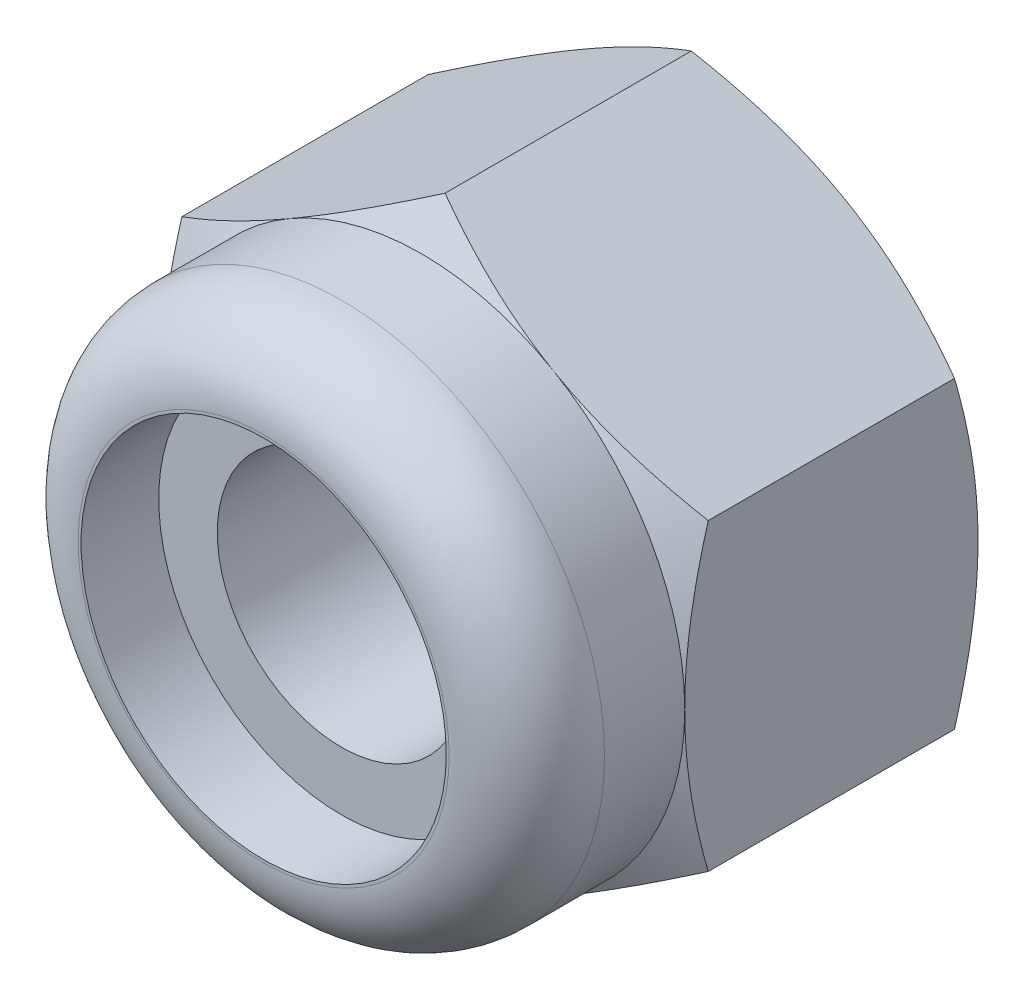
ISO-10303-21;
HEADER;
FILE_DESCRIPTION(('STEP AP214'),'2;1');
FILE_NAME('part.step','',(''),(''),'','','');
FILE_SCHEMA(('AUTOMOTIVE_DESIGN { 1 0 10303 214 1 1 1 1 }'));
ENDSEC;
DATA;
#1=APPLICATION_CONTEXT('core data for automotive mechanical design processes');
#2=APPLICATION_PROTOCOL_DEFINITION('international standard','automotive_design',2000,#1);
#3=PRODUCT_CONTEXT('',#1,'mechanical');
#4=PRODUCT('Part','Part','',(#3));
#5=PRODUCT_RELATED_PRODUCT_CATEGORY('part','',(#4));
#6=PRODUCT_DEFINITION_FORMATION('','',#4);
#7=PRODUCT_DEFINITION_CONTEXT('part definition',#1,'design');
#8=PRODUCT_DEFINITION('design','',#6,#7);
#9=PRODUCT_DEFINITION_SHAPE('','',#8);
#10=(LENGTH_UNIT() NAMED_UNIT(*) SI_UNIT(.MILLI.,.METRE.));
#11=(NAMED_UNIT(*) PLANE_ANGLE_UNIT() SI_UNIT($,.RADIAN.));
#12=(NAMED_UNIT(*) SI_UNIT($,.STERADIAN.) SOLID_ANGLE_UNIT());
#13=UNCERTAINTY_MEASURE_WITH_UNIT(LENGTH_MEASURE(1.E-05),#10,'distance_accuracy_value','');
#14=(GEOMETRIC_REPRESENTATION_CONTEXT(3) GLOBAL_UNCERTAINTY_ASSIGNED_CONTEXT((#13)) GLOBAL_UNIT_ASSIGNED_CONTEXT((#10,
#11,#12)) REPRESENTATION_CONTEXT('',''));
#15=CARTESIAN_POINT('',(0.,0.,0.));
#16=DIRECTION('',(0.,0.,1.));
#17=DIRECTION('',(1.,0.,0.));
#18=AXIS2_PLACEMENT_3D('',#15,#16,#17);
#19=CARTESIAN_POINT('',(0.,0.,-2.9));
#20=DIRECTION('',(0.,0.,1.));
#21=DIRECTION('',(1.,0.,0.));
#22=AXIS2_PLACEMENT_3D('',#19,#20,#21);
#23=CYLINDRICAL_SURFACE('',#22,1.65);
#24=CARTESIAN_POINT('',(0.,0.,2.06666666666667));
#25=DIRECTION('',(0.,0.,1.));
#26=DIRECTION('',(1.,0.,0.));
#27=AXIS2_PLACEMENT_3D('',#24,#25,#26);
#28=CIRCLE('',#27,1.65);
#29=CARTESIAN_POINT('',(1.65,0.,2.06666666666667));
#30=VERTEX_POINT('',#29);
#31=EDGE_CURVE('E443',#30,#30,#28,.T.);
#32=ORIENTED_EDGE('',*,*,#31,.T.);
#33=EDGE_LOOP('',(#32));
#34=FACE_BOUND('',#33,.T.);
#35=CARTESIAN_POINT('',(0.,0.,-2.6295273616266));
#36=DIRECTION('',(0.,0.,-1.));
#37=DIRECTION('',(-1.,0.,0.));
#38=AXIS2_PLACEMENT_3D('',#35,#36,#37);
#39=CIRCLE('',#38,1.65);
#40=CARTESIAN_POINT('',(-1.65,0.,-2.6295273616266));
#41=VERTEX_POINT('',#40);
#42=EDGE_CURVE('E166',#41,#41,#39,.F.);
#43=ORIENTED_EDGE('',*,*,#42,.F.);
#44=EDGE_LOOP('',(#43));
#45=FACE_BOUND('',#44,.T.);
#46=ADVANCED_FACE('F45',(#34,#45),#23,.F.);
#47=CARTESIAN_POINT('',(0.,4.04145188432738,-2.9));
#48=DIRECTION('',(-0.5,0.866025403784438,0.));
#49=DIRECTION('',(-0.866025403784438,-0.5,0.));
#50=AXIS2_PLACEMENT_3D('',#47,#48,#49);
#51=PLANE('',#50);
#52=DIRECTION('',(0.,0.,1.));
#53=VECTOR('',#52,1.);
#54=CARTESIAN_POINT('',(-3.5,2.02072594216369,-2.9));
#55=LINE('',#54,#53);
#56=CARTESIAN_POINT('',(-3.5,2.02072594216369,-2.58739260883035));
#57=VERTEX_POINT('',#56);
#58=CARTESIAN_POINT('',(-3.5,2.02072594216369,0.687392608830357));
#59=VERTEX_POINT('',#58);
#60=EDGE_CURVE('E151',#57,#59,#55,.T.);
#61=ORIENTED_EDGE('',*,*,#60,.T.);
#62=CARTESIAN_POINT('',(-3.5,2.02072594216369,0.687392608830358));
#63=CARTESIAN_POINT('',(-3.34753571198862,2.10875123988887,0.738237847268872));
#64=CARTESIAN_POINT('',(-3.19373835061782,2.19754618787695,0.784514344452547));
#65=CARTESIAN_POINT('',(-2.88479784793483,2.37591307026456,0.865084124311509));
#66=CARTESIAN_POINT('',(-2.72966825446088,2.46547718281602,0.899447412529487));
#67=CARTESIAN_POINT('',(-2.4954591528071,2.60069787070249,0.940394059302186));
#68=CARTESIAN_POINT('',(-2.41707581170764,2.64595251378624,0.952281641699641));
#69=CARTESIAN_POINT('',(-2.25994429612165,2.73667243660799,0.972247101680118));
#70=CARTESIAN_POINT('',(-2.18119612890669,2.78213771214774,0.980325054868103));
#71=CARTESIAN_POINT('',(-2.02299709460797,2.87347396718564,0.992499540829782));
#72=CARTESIAN_POINT('',(-1.94354483321946,2.91934575168602,0.996572117730429));
#73=CARTESIAN_POINT('',(-1.78454594405513,3.0111438031459,1.00056823982665));
#74=CARTESIAN_POINT('',(-1.70499929998391,3.05707007951355,1.00049091474959));
#75=CARTESIAN_POINT('',(-1.62549330307455,3.10297288823136,0.998295949684423));
#76=B_SPLINE_CURVE_WITH_KNOTS('',3,(#62,#63,#64,#65,#66,#67,#68,#69,#70,#71,#72,#73,#74,#75),
.UNSPECIFIED.,.F.,.F.,(4,2,2,2,2,2,4),(0.,0.550013721798602,1.09673832371843,1.37052430293701,
1.64430484843786,1.91971307497045,2.19517905736821),.UNSPECIFIED.);
#77=CARTESIAN_POINT('',(-1.75000000000827,3.03108891324076,0.999999999999999));
#78=VERTEX_POINT('',#77);
#79=EDGE_CURVE('E117',#59,#78,#76,.T.);
#80=ORIENTED_EDGE('',*,*,#79,.T.);
#81=CARTESIAN_POINT('',(0.,4.04145188432738,0.687392608830358));
#82=CARTESIAN_POINT('',(-0.15246428801139,3.9534265866022,0.738237847268873));
#83=CARTESIAN_POINT('',(-0.306261649382186,3.86463163861412,0.784514344452547));
#84=CARTESIAN_POINT('',(-0.615202152065175,3.68626475622652,0.865084124311508));
#85=CARTESIAN_POINT('',(-0.770331745539122,3.59670064367506,0.899447412529487));
#86=CARTESIAN_POINT('',(-1.0045408471929,3.46147995578859,0.940394059302185));
#87=CARTESIAN_POINT('',(-1.08292418829236,3.41622531270483,0.95228164169964));
#88=CARTESIAN_POINT('',(-1.24005570387836,3.32550538988308,0.972247101680118));
#89=CARTESIAN_POINT('',(-1.31880387109331,3.28004011434334,0.980325054868103));
#90=CARTESIAN_POINT('',(-1.47700290539203,3.18870385930544,0.992499540829782));
#91=CARTESIAN_POINT('',(-1.55645516678054,3.14283207480505,0.996572117730429));
#92=CARTESIAN_POINT('',(-1.71545405594487,3.05103402334518,1.00056823982665));
#93=CARTESIAN_POINT('',(-1.79500070001609,3.00510774697753,1.00049091474959));
#94=CARTESIAN_POINT('',(-1.87450669692545,2.95920493825972,0.998295949684423));
#95=B_SPLINE_CURVE_WITH_KNOTS('',3,(#81,#82,#83,#84,#85,#86,#87,#88,#89,#90,#91,#92,#93,#94),
.UNSPECIFIED.,.F.,.F.,(4,2,2,2,2,2,4),(0.,0.550013721798602,1.09673832371842,1.37052430293701,
1.64430484843786,1.91971307497045,2.1951790573682),.UNSPECIFIED.);
#96=CARTESIAN_POINT('',(0.,4.04145188432738,0.687392608830354));
#97=VERTEX_POINT('',#96);
#98=EDGE_CURVE('E315',#78,#97,#95,.F.);
#99=ORIENTED_EDGE('',*,*,#98,.T.);
#100=DIRECTION('',(0.,0.,1.));
#101=VECTOR('',#100,1.);
#102=CARTESIAN_POINT('',(0.,4.04145188432738,-2.9));
#103=LINE('',#102,#101);
#104=CARTESIAN_POINT('',(0.,4.04145188432738,-2.58739260883035));
#105=VERTEX_POINT('',#104);
#106=EDGE_CURVE('E130',#105,#97,#103,.T.);
#107=ORIENTED_EDGE('',*,*,#106,.F.);
#108=CARTESIAN_POINT('',(-3.5002,2.02061047210985,-2.58732593930663));
#109=CARTESIAN_POINT('',(-3.34639282154755,2.10941108799267,-2.63861421101002));
#110=CARTESIAN_POINT('',(-3.19125798916558,2.19897822522909,-2.6852590461838));
#111=CARTESIAN_POINT('',(-2.87830199342322,2.37966345361545,-2.76667812446665));
#112=CARTESIAN_POINT('',(-2.72047526921251,2.47078475532382,-2.80142356441544));
#113=CARTESIAN_POINT('',(-2.40677778961988,2.65189807961074,-2.85550997281716));
#114=CARTESIAN_POINT('',(-2.25095530083931,2.74186223545399,-2.87521091373962));
#115=CARTESIAN_POINT('',(-1.93857711279463,2.92221386641056,-2.89872986726274));
#116=CARTESIAN_POINT('',(-1.78202254896577,3.01260068598001,-2.90256735545443));
#117=CARTESIAN_POINT('',(-1.48949078007901,3.1814939814933,-2.89458469812302));
#118=CARTESIAN_POINT('',(-1.3534697875421,3.26002573814993,-2.88472456593039));
#119=CARTESIAN_POINT('',(-1.08231397971101,3.41657761679354,-2.85347353310059));
#120=CARTESIAN_POINT('',(-0.94718010231532,3.49459719728458,-2.8320719567142));
#121=CARTESIAN_POINT('',(-0.675465207594818,3.65147186489429,-2.77856959211942));
#122=CARTESIAN_POINT('',(-0.538918580721666,3.73030709667644,-2.74624200555491));
#123=CARTESIAN_POINT('',(-0.2678619070555,3.88680174018324,-2.672871066192));
#124=CARTESIAN_POINT('',(-0.133348387531464,3.96446315689009,-2.63184495343013));
#125=CARTESIAN_POINT('',(0.000199999999999747,4.04156735438122,-2.58732593930662));
#126=B_SPLINE_CURVE_WITH_KNOTS('',3,(#108,#109,#110,#111,#112,#113,#114,#115,#116,#117,#118,
#119,#120,#121,#122,#123,#124,#125),.UNSPECIFIED.,.F.,.F.,(4,2,2,2,2,2,2,2,4),(0.,
0.554793832886253,1.11092123814984,1.65328467083219,2.19498204478403,2.6666513085086,
3.13875761298267,3.6213361260051,4.10296698719187),.UNSPECIFIED.);
#127=CARTESIAN_POINT('',(-1.75,3.03108891324554,-2.9));
#128=VERTEX_POINT('',#127);
#129=EDGE_CURVE('E155',#128,#105,#126,.T.);
#130=ORIENTED_EDGE('',*,*,#129,.F.);
#131=EDGE_CURVE('E217',#57,#128,#126,.T.);
#132=ORIENTED_EDGE('',*,*,#131,.F.);
#133=EDGE_LOOP('',(#61,#80,#99,#107,#130,#132));
#134=FACE_BOUND('',#133,.T.);
#135=ADVANCED_FACE('F320',(#134),#51,.T.);
#136=CARTESIAN_POINT('',(3.5,2.02072594216368,-2.9));
#137=DIRECTION('',(0.5,0.866025403784438,0.));
#138=DIRECTION('',(-0.866025403784438,0.5,0.));
#139=AXIS2_PLACEMENT_3D('',#136,#137,#138);
#140=PLANE('',#139);
#141=ORIENTED_EDGE('',*,*,#106,.T.);
#142=CARTESIAN_POINT('',(0.,4.04145188432738,0.687392608830362));
#143=CARTESIAN_POINT('',(0.152464288011386,3.9534265866022,0.738237847268876));
#144=CARTESIAN_POINT('',(0.306261649382182,3.86463163861412,0.78451434445255));
#145=CARTESIAN_POINT('',(0.61520215206517,3.68626475622651,0.865084124311512));
#146=CARTESIAN_POINT('',(0.770331745539117,3.59670064367505,0.899447412529491));
#147=CARTESIAN_POINT('',(1.0045408471929,3.46147995578858,0.940394059302189));
#148=CARTESIAN_POINT('',(1.08292418829236,3.41622531270483,0.952281641699644));
#149=CARTESIAN_POINT('',(1.24005570387835,3.32550538988308,0.972247101680121));
#150=CARTESIAN_POINT('',(1.31880387109331,3.28004011434333,0.980325054868106));
#151=CARTESIAN_POINT('',(1.47700290539202,3.18870385930543,0.992499540829786));
#152=CARTESIAN_POINT('',(1.55645516678054,3.14283207480505,0.996572117730432));
#153=CARTESIAN_POINT('',(1.71545405594486,3.05103402334517,1.00056823982665));
#154=CARTESIAN_POINT('',(1.79500070001608,3.00510774697753,1.00049091474959));
#155=CARTESIAN_POINT('',(1.87450669692545,2.95920493825971,0.998295949684427));
#156=B_SPLINE_CURVE_WITH_KNOTS('',3,(#142,#143,#144,#145,#146,#147,#148,#149,#150,#151,#152,
#153,#154,#155),.UNSPECIFIED.,.F.,.F.,(4,2,2,2,2,2,4),(0.,0.550013721798601,1.09673832371842,
1.37052430293701,1.64430484843785,1.91971307497045,2.1951790573682),.UNSPECIFIED.);
#157=CARTESIAN_POINT('',(1.75,3.03108891324553,1.));
#158=VERTEX_POINT('',#157);
#159=EDGE_CURVE('E108',#97,#158,#156,.T.);
#160=ORIENTED_EDGE('',*,*,#159,.T.);
#161=CARTESIAN_POINT('',(3.5,2.02072594216368,0.687392608830362));
#162=CARTESIAN_POINT('',(3.34753571198861,2.10875123988886,0.738237847268876));
#163=CARTESIAN_POINT('',(3.19373835061782,2.19754618787695,0.784514344452551));
#164=CARTESIAN_POINT('',(2.88479784793483,2.37591307026455,0.865084124311512));
#165=CARTESIAN_POINT('',(2.72966825446088,2.46547718281601,0.899447412529491));
#166=CARTESIAN_POINT('',(2.4954591528071,2.60069787070248,0.940394059302189));
#167=CARTESIAN_POINT('',(2.41707581170764,2.64595251378624,0.952281641699644));
#168=CARTESIAN_POINT('',(2.25994429612165,2.73667243660798,0.972247101680121));
#169=CARTESIAN_POINT('',(2.18119612890669,2.78213771214773,0.980325054868106));
#170=CARTESIAN_POINT('',(2.02299709460797,2.87347396718563,0.992499540829786));
#171=CARTESIAN_POINT('',(1.94354483321946,2.91934575168601,0.996572117730432));
#172=CARTESIAN_POINT('',(1.78454594405513,3.01114380314589,1.00056823982665));
#173=CARTESIAN_POINT('',(1.70499929998392,3.05707007951354,1.00049091474959));
#174=CARTESIAN_POINT('',(1.62549330307455,3.10297288823135,0.998295949684427));
#175=B_SPLINE_CURVE_WITH_KNOTS('',3,(#161,#162,#163,#164,#165,#166,#167,#168,#169,#170,#171,
#172,#173,#174),.UNSPECIFIED.,.F.,.F.,(4,2,2,2,2,2,4),(0.,0.550013721798602,1.09673832371842,
1.37052430293701,1.64430484843786,1.91971307497045,2.1951790573682),.UNSPECIFIED.);
#176=CARTESIAN_POINT('',(3.5,2.02072594216368,0.687392608830358));
#177=VERTEX_POINT('',#176);
#178=EDGE_CURVE('E50',#158,#177,#175,.F.);
#179=ORIENTED_EDGE('',*,*,#178,.T.);
#180=DIRECTION('',(0.,0.,1.));
#181=VECTOR('',#180,1.);
#182=CARTESIAN_POINT('',(3.5,2.02072594216368,-2.9));
#183=LINE('',#182,#181);
#184=CARTESIAN_POINT('',(3.5,2.02072594216369,-2.58739260883035));
#185=VERTEX_POINT('',#184);
#186=EDGE_CURVE('E122',#185,#177,#183,.T.);
#187=ORIENTED_EDGE('',*,*,#186,.F.);
#188=CARTESIAN_POINT('',(-0.000200000000000202,4.04156735438122,-2.58732593930662));
#189=CARTESIAN_POINT('',(0.153607178452447,3.9527667384984,-2.63861421101002));
#190=CARTESIAN_POINT('',(0.308742010834422,3.86319960126198,-2.6852590461838));
#191=CARTESIAN_POINT('',(0.621698006576779,3.68251437287562,-2.76667812446665));
#192=CARTESIAN_POINT('',(0.779524730787494,3.59139307116725,-2.80142356441544));
#193=CARTESIAN_POINT('',(1.09322221038013,3.41027974688033,-2.85550997281717));
#194=CARTESIAN_POINT('',(1.24904469916069,3.32031559103708,-2.87521091373962));
#195=CARTESIAN_POINT('',(1.56142288720537,3.13996396008051,-2.89872986726275));
#196=CARTESIAN_POINT('',(1.71797745103423,3.04957714051106,-2.90256735545444));
#197=CARTESIAN_POINT('',(2.01050921992099,2.88068384499777,-2.89458469812303));
#198=CARTESIAN_POINT('',(2.14653021245791,2.80215208834114,-2.88472456593039));
#199=CARTESIAN_POINT('',(2.41768602028899,2.64560020969753,-2.8534735331006));
#200=CARTESIAN_POINT('',(2.55281989768468,2.56758062920649,-2.8320719567142));
#201=CARTESIAN_POINT('',(2.82453479240518,2.41070596159678,-2.77856959211943));
#202=CARTESIAN_POINT('',(2.96108141927833,2.33187072981463,-2.74624200555492));
#203=CARTESIAN_POINT('',(3.2321380929445,2.17537608630782,-2.67287106619201));
#204=CARTESIAN_POINT('',(3.36665161246854,2.09771466960098,-2.63184495343013));
#205=CARTESIAN_POINT('',(3.5002,2.02061047210985,-2.58732593930663));
#206=B_SPLINE_CURVE_WITH_KNOTS('',3,(#188,#189,#190,#191,#192,#193,#194,#195,#196,#197,#198,
#199,#200,#201,#202,#203,#204,#205),.UNSPECIFIED.,.F.,.F.,(4,2,2,2,2,2,2,2,4),(0.,
0.554793832886255,1.11092123814984,1.65328467083219,2.19498204478404,2.6666513085086,
3.13875761298268,3.6213361260051,4.10296698719188),.UNSPECIFIED.);
#207=CARTESIAN_POINT('',(1.75,3.03108891324554,-2.9));
#208=VERTEX_POINT('',#207);
#209=EDGE_CURVE('E387',#208,#185,#206,.T.);
#210=ORIENTED_EDGE('',*,*,#209,.F.);
#211=EDGE_CURVE('E417',#105,#208,#206,.T.);
#212=ORIENTED_EDGE('',*,*,#211,.F.);
#213=EDGE_LOOP('',(#141,#160,#179,#187,#210,#212));
#214=FACE_BOUND('',#213,.T.);
#215=ADVANCED_FACE('F120',(#214),#140,.T.);
#216=CARTESIAN_POINT('',(3.5,2.02072594216368,-2.9));
#217=DIRECTION('',(-1.,0.,0.));
#218=DIRECTION('',(0.,0.,1.));
#219=AXIS2_PLACEMENT_3D('',#216,#217,#218);
#220=PLANE('',#219);
#221=CARTESIAN_POINT('',(3.5,-2.0207259421637,0.687392608830358));
#222=CARTESIAN_POINT('',(3.5,-1.84467534671334,0.738237847268873));
#223=CARTESIAN_POINT('',(3.5,-1.66708545073717,0.784514344452548));
#224=CARTESIAN_POINT('',(3.5,-1.31035168596197,0.865084124311509));
#225=CARTESIAN_POINT('',(3.5,-1.13122346085904,0.899447412529488));
#226=CARTESIAN_POINT('',(3.5,-0.860782085086102,0.940394059302187));
#227=CARTESIAN_POINT('',(3.5,-0.77027279891859,0.952281641699641));
#228=CARTESIAN_POINT('',(3.5,-0.588832953275097,0.972247101680119));
#229=CARTESIAN_POINT('',(3.5,-0.497902402195605,0.980325054868104));
#230=CARTESIAN_POINT('',(3.5,-0.3152298921198,0.992499540829784));
#231=CARTESIAN_POINT('',(3.5,-0.223486323119036,0.99657211773043));
#232=CARTESIAN_POINT('',(3.5,-0.039890220199284,1.00056823982665));
#233=CARTESIAN_POINT('',(3.5,0.0519623325360135,1.00049091474959));
#234=CARTESIAN_POINT('',(3.5,0.143767949971636,0.998295949684424));
#235=B_SPLINE_CURVE_WITH_KNOTS('',3,(#221,#222,#223,#224,#225,#226,#227,#228,#229,#230,#231,
#232,#233,#234),.UNSPECIFIED.,.F.,.F.,(4,2,2,2,2,2,4),(0.,0.550013721798603,1.09673832371842,
1.37052430293701,1.64430484843786,1.91971307497045,2.1951790573682),.UNSPECIFIED.);
#236=CARTESIAN_POINT('',(3.5,-2.02072594216369,0.687392608830355));
#237=VERTEX_POINT('',#236);
#238=CARTESIAN_POINT('',(3.5,0.,1.));
#239=VERTEX_POINT('',#238);
#240=EDGE_CURVE('E191',#237,#239,#235,.T.);
#241=ORIENTED_EDGE('',*,*,#240,.F.);
#242=DIRECTION('',(0.,0.,1.));
#243=VECTOR('',#242,1.);
#244=CARTESIAN_POINT('',(3.5,-2.02072594216369,-2.9));
#245=LINE('',#244,#243);
#246=CARTESIAN_POINT('',(3.5,-2.02072594216369,-2.58739260883035));
#247=VERTEX_POINT('',#246);
#248=EDGE_CURVE('E131',#247,#237,#245,.T.);
#249=ORIENTED_EDGE('',*,*,#248,.F.);
#250=CARTESIAN_POINT('',(3.5,-5.35926299121406,-1.22515653141444));
#251=CARTESIAN_POINT('',(3.5,-5.20559319908842,-1.29941826307896));
#252=CARTESIAN_POINT('',(3.5,-5.05156008083376,-1.37294177166853));
#253=CARTESIAN_POINT('',(3.5,-4.74257074180711,-1.51809049655248));
#254=CARTESIAN_POINT('',(3.5,-4.58761436682437,-1.58971538417867));
#255=CARTESIAN_POINT('',(3.5,-4.27574500225543,-1.73102234482376));
#256=CARTESIAN_POINT('',(3.5,-4.11882589028192,-1.80069095431984));
#257=CARTESIAN_POINT('',(3.5,-3.80369792903856,-1.93703573775724));
#258=CARTESIAN_POINT('',(3.5,-3.64548914750596,-2.00371206768048));
#259=CARTESIAN_POINT('',(3.5,-3.32556618401856,-2.13406818090493));
#260=CARTESIAN_POINT('',(3.5,-3.16383281219924,-2.19770112631113));
#261=CARTESIAN_POINT('',(3.5,-2.83845840945598,-2.31998329791051));
#262=CARTESIAN_POINT('',(3.5,-2.67481716858826,-2.37863196962931));
#263=CARTESIAN_POINT('',(3.5,-2.34570278472049,-2.48936972012298));
#264=CARTESIAN_POINT('',(3.5,-2.18023438248743,-2.54147274456414));
#265=CARTESIAN_POINT('',(3.5,-1.8469452280637,-2.63742706302356));
#266=CARTESIAN_POINT('',(3.5,-1.6791252378753,-2.68128096653284));
#267=CARTESIAN_POINT('',(3.5,-1.34101828610925,-2.75860805441521));
#268=CARTESIAN_POINT('',(3.5,-1.17073068027694,-2.79207847478803));
#269=CARTESIAN_POINT('',(3.5,-0.828102385138487,-2.84638504356795));
#270=CARTESIAN_POINT('',(3.5,-0.655761694017305,-2.86722118080476));
#271=CARTESIAN_POINT('',(3.5,-0.311020490924452,-2.89441591349424));
#272=CARTESIAN_POINT('',(3.5,-0.138627397207262,-2.90086616316591));
#273=CARTESIAN_POINT('',(3.5,0.206038074906533,-2.89894644192205));
#274=CARTESIAN_POINT('',(3.5,0.378310473023177,-2.89058031803657));
#275=CARTESIAN_POINT('',(3.5,0.672490555822325,-2.86423110721311));
#276=CARTESIAN_POINT('',(3.5,0.79472279108409,-2.84967936596158));
#277=CARTESIAN_POINT('',(3.5,1.0382430543056,-2.81406326594664));
#278=CARTESIAN_POINT('',(3.5,1.15953093025886,-2.79299788007386));
#279=CARTESIAN_POINT('',(3.5,1.52187914771348,-2.72113681291855));
#280=CARTESIAN_POINT('',(3.5,1.76124104212632,-2.66169472437799));
#281=CARTESIAN_POINT('',(3.5,2.11940971387708,-2.55917318559745));
#282=CARTESIAN_POINT('',(3.5,2.24008344316346,-2.52225030091482));
#283=CARTESIAN_POINT('',(3.5,2.48017139213728,-2.44475099230071));
#284=CARTESIAN_POINT('',(3.5,2.59958641795613,-2.40417708833645));
#285=CARTESIAN_POINT('',(3.5,2.83665760451798,-2.32022001321725));
#286=CARTESIAN_POINT('',(3.5,2.95431988203483,-2.27685393996569));
#287=CARTESIAN_POINT('',(3.5,3.188731535088,-2.18757644043314));
#288=CARTESIAN_POINT('',(3.5,3.30548051959464,-2.14166398540705));
#289=CARTESIAN_POINT('',(3.5,3.42180736613349,-2.09472961927593));
#290=B_SPLINE_CURVE_WITH_KNOTS('',3,(#250,#251,#252,#253,#254,#255,#256,#257,#258,#259,#260,
#261,#262,#263,#264,#265,#266,#267,#268,#269,#270,#271,#272,#273,#274,#275,#276,#277,#278,#279,
#280,#281,#282,#283,#284,#285,#286,#287,#288,#289),.UNSPECIFIED.,.F.,.F.,(4,2,2,2,2,2,2,2,2,2,2,
2,2,2,2,2,2,2,2,4),(0.,0.512025318465737,1.02413870177436,1.53918270315241,2.05419982499224,
2.57553975872798,3.09693761309353,3.61720506610401,4.13730766217537,4.65754858684365,
5.17778997146961,5.69470725122282,6.21149033452401,6.58059623222331,6.94976036239485,
7.68863804939851,8.06719621660478,8.44549507476761,8.82166461280099,9.19798724733411),.UNSPECIFIED.);
#291=CARTESIAN_POINT('',(3.5,0.,-2.9));
#292=VERTEX_POINT('',#291);
#293=EDGE_CURVE('E208',#247,#292,#290,.T.);
#294=ORIENTED_EDGE('',*,*,#293,.T.);
#295=EDGE_CURVE('E128',#292,#185,#290,.T.);
#296=ORIENTED_EDGE('',*,*,#295,.T.);
#297=ORIENTED_EDGE('',*,*,#186,.T.);
#298=CARTESIAN_POINT('',(3.5,2.02072594216369,0.687392608830361));
#299=CARTESIAN_POINT('',(3.5,1.84467534671333,0.738237847268875));
#300=CARTESIAN_POINT('',(3.5,1.66708545073716,0.784514344452549));
#301=CARTESIAN_POINT('',(3.5,1.31035168596196,0.865084124311511));
#302=CARTESIAN_POINT('',(3.5,1.13122346085904,0.89944741252949));
#303=CARTESIAN_POINT('',(3.5,0.860782085086093,0.940394059302188));
#304=CARTESIAN_POINT('',(3.5,0.770272798918581,0.952281641699643));
#305=CARTESIAN_POINT('',(3.5,0.588832953275089,0.97224710168012));
#306=CARTESIAN_POINT('',(3.5,0.497902402195597,0.980325054868105));
#307=CARTESIAN_POINT('',(3.5,0.315229892119792,0.992499540829784));
#308=CARTESIAN_POINT('',(3.5,0.223486323119028,0.99657211773043));
#309=CARTESIAN_POINT('',(3.5,0.0398902201992757,1.00056823982665));
#310=CARTESIAN_POINT('',(3.5,-0.0519623325360217,1.00049091474959));
#311=CARTESIAN_POINT('',(3.5,-0.143767949971644,0.998295949684424));
#312=B_SPLINE_CURVE_WITH_KNOTS('',3,(#298,#299,#300,#301,#302,#303,#304,#305,#306,#307,#308,
#309,#310,#311),.UNSPECIFIED.,.F.,.F.,(4,2,2,2,2,2,4),(0.,0.550013721798602,1.09673832371842,
1.37052430293701,1.64430484843786,1.91971307497045,2.1951790573682),.UNSPECIFIED.);
#313=EDGE_CURVE('E111',#239,#177,#312,.F.);
#314=ORIENTED_EDGE('',*,*,#313,.F.);
#315=EDGE_LOOP('',(#241,#249,#294,#296,#297,#314));
#316=FACE_BOUND('',#315,.T.);
#317=ADVANCED_FACE('F125',(#316),#220,.F.);
#318=CARTESIAN_POINT('',(0.,-4.04145188432739,-2.9));
#319=DIRECTION('',(0.5,-0.866025403784438,0.));
#320=DIRECTION('',(0.866025403784438,0.5,0.));
#321=AXIS2_PLACEMENT_3D('',#318,#319,#320);
#322=PLANE('',#321);
#323=ORIENTED_EDGE('',*,*,#248,.T.);
#324=CARTESIAN_POINT('',(3.50000000000001,-2.0207259421637,0.687392608830355));
#325=CARTESIAN_POINT('',(3.34753571198862,-2.10875123988888,0.738237847268869));
#326=CARTESIAN_POINT('',(3.19373835061782,-2.19754618787696,0.784514344452543));
#327=CARTESIAN_POINT('',(2.88479784793483,-2.37591307026457,0.865084124311505));
#328=CARTESIAN_POINT('',(2.72966825446088,-2.46547718281603,0.899447412529483));
#329=CARTESIAN_POINT('',(2.4954591528071,-2.6006978707025,0.940394059302182));
#330=CARTESIAN_POINT('',(2.41707581170764,-2.64595251378625,0.952281641699636));
#331=CARTESIAN_POINT('',(2.25994429612165,-2.736672436608,0.972247101680113));
#332=CARTESIAN_POINT('',(2.18119612890669,-2.78213771214775,0.980325054868098));
#333=CARTESIAN_POINT('',(2.02299709460797,-2.87347396718565,0.992499540829777));
#334=CARTESIAN_POINT('',(1.94354483321946,-2.91934575168603,0.996572117730424));
#335=CARTESIAN_POINT('',(1.78454594405513,-3.01114380314591,1.00056823982664));
#336=CARTESIAN_POINT('',(1.70499929998391,-3.05707007951356,1.00049091474958));
#337=CARTESIAN_POINT('',(1.62549330307455,-3.10297288823137,0.998295949684418));
#338=B_SPLINE_CURVE_WITH_KNOTS('',3,(#324,#325,#326,#327,#328,#329,#330,#331,#332,#333,#334,
#335,#336,#337),.UNSPECIFIED.,.F.,.F.,(4,2,2,2,2,2,4),(0.,0.550013721798604,1.09673832371843,
1.37052430293701,1.64430484843786,1.91971307497046,2.19517905736821),.UNSPECIFIED.);
#339=CARTESIAN_POINT('',(1.75000000000827,-3.03108891324077,0.999999999999997));
#340=VERTEX_POINT('',#339);
#341=EDGE_CURVE('E396',#237,#340,#338,.T.);
#342=ORIENTED_EDGE('',*,*,#341,.T.);
#343=CARTESIAN_POINT('',(0.,-4.04145188432739,0.687392608830352));
#344=CARTESIAN_POINT('',(0.152464288011389,-3.95342658660221,0.738237847268866));
#345=CARTESIAN_POINT('',(0.306261649382185,-3.86463163861413,0.784514344452541));
#346=CARTESIAN_POINT('',(0.615202152065175,-3.68626475622653,0.865084124311503));
#347=CARTESIAN_POINT('',(0.770331745539123,-3.59670064367507,0.899447412529482));
#348=CARTESIAN_POINT('',(1.0045408471929,-3.4614799557886,0.94039405930218));
#349=CARTESIAN_POINT('',(1.08292418829237,-3.41622531270484,0.952281641699635));
#350=CARTESIAN_POINT('',(1.24005570387836,-3.32550538988309,0.972247101680112));
#351=CARTESIAN_POINT('',(1.31880387109332,-3.28004011434335,0.980325054868098));
#352=CARTESIAN_POINT('',(1.47700290539203,-3.18870385930544,0.992499540829777));
#353=CARTESIAN_POINT('',(1.55645516678055,-3.14283207480506,0.996572117730424));
#354=CARTESIAN_POINT('',(1.71545405594487,-3.05103402334519,1.00056823982664));
#355=CARTESIAN_POINT('',(1.79500070001609,-3.00510774697754,1.00049091474958));
#356=CARTESIAN_POINT('',(1.87450669692546,-2.95920493825973,0.998295949684418));
#357=B_SPLINE_CURVE_WITH_KNOTS('',3,(#343,#344,#345,#346,#347,#348,#349,#350,#351,#352,#353,
#354,#355,#356),.UNSPECIFIED.,.F.,.F.,(4,2,2,2,2,2,4),(0.,0.550013721798603,1.09673832371843,
1.37052430293701,1.64430484843786,1.91971307497046,2.19517905736821),.UNSPECIFIED.);
#358=CARTESIAN_POINT('',(0.,-4.04145188432739,0.687392608830348));
#359=VERTEX_POINT('',#358);
#360=EDGE_CURVE('E280',#340,#359,#357,.F.);
#361=ORIENTED_EDGE('',*,*,#360,.T.);
#362=DIRECTION('',(0.,0.,1.));
#363=VECTOR('',#362,1.);
#364=CARTESIAN_POINT('',(0.,-4.04145188432739,-2.9));
#365=LINE('',#364,#363);
#366=CARTESIAN_POINT('',(0.,-4.04145188432738,-2.58739260883035));
#367=VERTEX_POINT('',#366);
#368=EDGE_CURVE('E140',#367,#359,#365,.T.);
#369=ORIENTED_EDGE('',*,*,#368,.F.);
#370=CARTESIAN_POINT('',(3.5002,-2.02061047210986,-2.58732593930662));
#371=CARTESIAN_POINT('',(3.34639282154755,-2.10941108799268,-2.63861421101001));
#372=CARTESIAN_POINT('',(3.19125798916558,-2.1989782252291,-2.6852590461838));
#373=CARTESIAN_POINT('',(2.87830199342322,-2.37966345361546,-2.76667812446665));
#374=CARTESIAN_POINT('',(2.72047526921251,-2.47078475532383,-2.80142356441543));
#375=CARTESIAN_POINT('',(2.40677778961987,-2.65189807961075,-2.85550997281716));
#376=CARTESIAN_POINT('',(2.25095530083931,-2.741862235454,-2.87521091373961));
#377=CARTESIAN_POINT('',(1.93857711279463,-2.92221386641057,-2.89872986726274));
#378=CARTESIAN_POINT('',(1.78202254896577,-3.01260068598002,-2.90256735545443));
#379=CARTESIAN_POINT('',(1.48949078007901,-3.18149398149331,-2.89458469812302));
#380=CARTESIAN_POINT('',(1.35346978754209,-3.26002573814994,-2.88472456593039));
#381=CARTESIAN_POINT('',(1.08231397971101,-3.41657761679355,-2.85347353310059));
#382=CARTESIAN_POINT('',(0.947180102315318,-3.49459719728459,-2.83207195671419));
#383=CARTESIAN_POINT('',(0.675465207594817,-3.6514718648943,-2.77856959211941));
#384=CARTESIAN_POINT('',(0.538918580721665,-3.73030709667645,-2.74624200555491));
#385=CARTESIAN_POINT('',(0.267861907055499,-3.88680174018326,-2.672871066192));
#386=CARTESIAN_POINT('',(0.133348387531464,-3.9644631568901,-2.63184495343012));
#387=CARTESIAN_POINT('',(-0.00020000000000023,-4.04156735438123,-2.58732593930662));
#388=B_SPLINE_CURVE_WITH_KNOTS('',3,(#370,#371,#372,#373,#374,#375,#376,#377,#378,#379,#380,
#381,#382,#383,#384,#385,#386,#387),.UNSPECIFIED.,.F.,.F.,(4,2,2,2,2,2,2,2,4),(0.,
0.554793832886254,1.11092123814984,1.65328467083219,2.19498204478403,2.6666513085086,
3.13875761298267,3.6213361260051,4.10296698719187),.UNSPECIFIED.);
#389=CARTESIAN_POINT('',(1.75,-3.03108891324554,-2.9));
#390=VERTEX_POINT('',#389);
#391=EDGE_CURVE('E219',#390,#367,#388,.T.);
#392=ORIENTED_EDGE('',*,*,#391,.F.);
#393=EDGE_CURVE('E218',#247,#390,#388,.T.);
#394=ORIENTED_EDGE('',*,*,#393,.F.);
#395=EDGE_LOOP('',(#323,#342,#361,#369,#392,#394));
#396=FACE_BOUND('',#395,.T.);
#397=ADVANCED_FACE('F200',(#396),#322,.T.);
#398=CARTESIAN_POINT('',(-3.5,-2.02072594216369,-2.9));
#399=DIRECTION('',(-0.5,-0.866025403784438,0.));
#400=DIRECTION('',(0.866025403784438,-0.5,0.));
#401=AXIS2_PLACEMENT_3D('',#398,#399,#400);
#402=PLANE('',#401);
#403=ORIENTED_EDGE('',*,*,#368,.T.);
#404=CARTESIAN_POINT('',(0.,-4.04145188432739,0.687392608830356));
#405=CARTESIAN_POINT('',(-0.152464288011386,-3.95342658660221,0.73823784726887));
#406=CARTESIAN_POINT('',(-0.306261649382181,-3.86463163861413,0.784514344452545));
#407=CARTESIAN_POINT('',(-0.615202152065171,-3.68626475622652,0.865084124311506));
#408=CARTESIAN_POINT('',(-0.770331745539118,-3.59670064367506,0.899447412529485));
#409=CARTESIAN_POINT('',(-1.0045408471929,-3.46147995578859,0.940394059302184));
#410=CARTESIAN_POINT('',(-1.08292418829236,-3.41622531270483,0.952281641699639));
#411=CARTESIAN_POINT('',(-1.24005570387835,-3.32550538988309,0.972247101680116));
#412=CARTESIAN_POINT('',(-1.31880387109331,-3.28004011434334,0.980325054868101));
#413=CARTESIAN_POINT('',(-1.47700290539203,-3.18870385930544,0.992499540829781));
#414=CARTESIAN_POINT('',(-1.55645516678054,-3.14283207480506,0.996572117730427));
#415=CARTESIAN_POINT('',(-1.71545405594487,-3.05103402334518,1.00056823982665));
#416=CARTESIAN_POINT('',(-1.79500070001609,-3.00510774697753,1.00049091474959));
#417=CARTESIAN_POINT('',(-1.87450669692545,-2.95920493825972,0.998295949684422));
#418=B_SPLINE_CURVE_WITH_KNOTS('',3,(#404,#405,#406,#407,#408,#409,#410,#411,#412,#413,#414,
#415,#416,#417),.UNSPECIFIED.,.F.,.F.,(4,2,2,2,2,2,4),(0.,0.550013721798602,1.09673832371842,
1.37052430293701,1.64430484843786,1.91971307497045,2.1951790573682),.UNSPECIFIED.);
#419=CARTESIAN_POINT('',(-1.75,-3.03108891324554,0.999999999999999));
#420=VERTEX_POINT('',#419);
#421=EDGE_CURVE('E272',#359,#420,#418,.T.);
#422=ORIENTED_EDGE('',*,*,#421,.T.);
#423=CARTESIAN_POINT('',(-3.5,-2.0207259421637,0.687392608830361));
#424=CARTESIAN_POINT('',(-3.34753571198861,-2.10875123988888,0.738237847268874));
#425=CARTESIAN_POINT('',(-3.19373835061781,-2.19754618787696,0.784514344452549));
#426=CARTESIAN_POINT('',(-2.88479784793482,-2.37591307026456,0.865084124311509));
#427=CARTESIAN_POINT('',(-2.72966825446088,-2.46547718281602,0.899447412529488));
#428=CARTESIAN_POINT('',(-2.49545915280709,-2.60069787070249,0.940394059302186));
#429=CARTESIAN_POINT('',(-2.41707581170763,-2.64595251378625,0.95228164169964));
#430=CARTESIAN_POINT('',(-2.25994429612164,-2.736672436608,0.972247101680117));
#431=CARTESIAN_POINT('',(-2.18119612890669,-2.78213771214774,0.980325054868102));
#432=CARTESIAN_POINT('',(-2.02299709460797,-2.87347396718564,0.992499540829781));
#433=CARTESIAN_POINT('',(-1.94354483321946,-2.91934575168603,0.996572117730428));
#434=CARTESIAN_POINT('',(-1.78454594405513,-3.0111438031459,1.00056823982665));
#435=CARTESIAN_POINT('',(-1.70499929998391,-3.05707007951355,1.00049091474959));
#436=CARTESIAN_POINT('',(-1.62549330307455,-3.10297288823136,0.998295949684422));
#437=B_SPLINE_CURVE_WITH_KNOTS('',3,(#423,#424,#425,#426,#427,#428,#429,#430,#431,#432,#433,
#434,#435,#436),.UNSPECIFIED.,.F.,.F.,(4,2,2,2,2,2,4),(0.,0.550013721798601,1.09673832371842,
1.37052430293701,1.64430484843785,1.91971307497045,2.1951790573682),.UNSPECIFIED.);
#438=CARTESIAN_POINT('',(-3.5,-2.02072594216369,0.687392608830355));
#439=VERTEX_POINT('',#438);
#440=EDGE_CURVE('E281',#420,#439,#437,.F.);
#441=ORIENTED_EDGE('',*,*,#440,.T.);
#442=DIRECTION('',(0.,0.,1.));
#443=VECTOR('',#442,1.);
#444=CARTESIAN_POINT('',(-3.5,-2.02072594216369,-2.9));
#445=LINE('',#444,#443);
#446=CARTESIAN_POINT('',(-3.5,-2.02072594216369,-2.58739260883035));
#447=VERTEX_POINT('',#446);
#448=EDGE_CURVE('E147',#447,#439,#445,.T.);
#449=ORIENTED_EDGE('',*,*,#448,.F.);
#450=CARTESIAN_POINT('',(0.000199999999999409,-4.04156735438123,-2.58732593930662));
#451=CARTESIAN_POINT('',(-0.153607178452448,-3.95276673849841,-2.63861421101001));
#452=CARTESIAN_POINT('',(-0.308742010834423,-3.86319960126199,-2.6852590461838));
#453=CARTESIAN_POINT('',(-0.621698006576781,-3.68251437287563,-2.76667812446665));
#454=CARTESIAN_POINT('',(-0.779524730787497,-3.59139307116725,-2.80142356441544));
#455=CARTESIAN_POINT('',(-1.09322221038013,-3.41027974688034,-2.85550997281716));
#456=CARTESIAN_POINT('',(-1.2490446991607,-3.32031559103708,-2.87521091373962));
#457=CARTESIAN_POINT('',(-1.56142288720538,-3.13996396008052,-2.89872986726274));
#458=CARTESIAN_POINT('',(-1.71797745103424,-3.04957714051106,-2.90256735545443));
#459=CARTESIAN_POINT('',(-2.010509219921,-2.88068384499778,-2.89458469812302));
#460=CARTESIAN_POINT('',(-2.14653021245791,-2.80215208834115,-2.88472456593039));
#461=CARTESIAN_POINT('',(-2.417686020289,-2.64560020969754,-2.85347353310059));
#462=CARTESIAN_POINT('',(-2.55281989768469,-2.5675806292065,-2.8320719567142));
#463=CARTESIAN_POINT('',(-2.82453479240519,-2.41070596159679,-2.77856959211942));
#464=CARTESIAN_POINT('',(-2.96108141927834,-2.33187072981464,-2.74624200555491));
#465=CARTESIAN_POINT('',(-3.2321380929445,-2.17537608630783,-2.672871066192));
#466=CARTESIAN_POINT('',(-3.36665161246854,-2.09771466960099,-2.63184495343013));
#467=CARTESIAN_POINT('',(-3.5002,-2.02061047210985,-2.58732593930662));
#468=B_SPLINE_CURVE_WITH_KNOTS('',3,(#450,#451,#452,#453,#454,#455,#456,#457,#458,#459,#460,
#461,#462,#463,#464,#465,#466,#467),.UNSPECIFIED.,.F.,.F.,(4,2,2,2,2,2,2,2,4),(0.,
0.554793832886256,1.11092123814984,1.65328467083219,2.19498204478404,2.66665130850861,
3.13875761298268,3.6213361260051,4.10296698719188),.UNSPECIFIED.);
#469=CARTESIAN_POINT('',(-1.75,-3.03108891324554,-2.9));
#470=VERTEX_POINT('',#469);
#471=EDGE_CURVE('E252',#470,#447,#468,.T.);
#472=ORIENTED_EDGE('',*,*,#471,.F.);
#473=EDGE_CURVE('E260',#367,#470,#468,.T.);
#474=ORIENTED_EDGE('',*,*,#473,.F.);
#475=EDGE_LOOP('',(#403,#422,#441,#449,#472,#474));
#476=FACE_BOUND('',#475,.T.);
#477=ADVANCED_FACE('F262',(#476),#402,.T.);
#478=CARTESIAN_POINT('',(-3.5,2.02072594216369,-2.9));
#479=DIRECTION('',(-1.,0.,0.));
#480=DIRECTION('',(0.,0.,1.));
#481=AXIS2_PLACEMENT_3D('',#478,#479,#480);
#482=PLANE('',#481);
#483=ORIENTED_EDGE('',*,*,#448,.T.);
#484=CARTESIAN_POINT('',(-3.5,-2.0207259421637,0.687392608830357));
#485=CARTESIAN_POINT('',(-3.5,-1.84467534671334,0.738237847268872));
#486=CARTESIAN_POINT('',(-3.5,-1.66708545073717,0.784514344452547));
#487=CARTESIAN_POINT('',(-3.5,-1.31035168596197,0.865084124311509));
#488=CARTESIAN_POINT('',(-3.5,-1.13122346085905,0.899447412529487));
#489=CARTESIAN_POINT('',(-3.5,-0.860782085086103,0.940394059302186));
#490=CARTESIAN_POINT('',(-3.5,-0.770272798918591,0.952281641699641));
#491=CARTESIAN_POINT('',(-3.5,-0.588832953275098,0.972247101680119));
#492=CARTESIAN_POINT('',(-3.5,-0.497902402195606,0.980325054868104));
#493=CARTESIAN_POINT('',(-3.5,-0.315229892119801,0.992499540829784));
#494=CARTESIAN_POINT('',(-3.5,-0.223486323119036,0.99657211773043));
#495=CARTESIAN_POINT('',(-3.5,-0.0398902201992841,1.00056823982665));
#496=CARTESIAN_POINT('',(-3.5,0.0519623325360134,1.00049091474959));
#497=CARTESIAN_POINT('',(-3.5,0.143767949971636,0.998295949684424));
#498=B_SPLINE_CURVE_WITH_KNOTS('',3,(#484,#485,#486,#487,#488,#489,#490,#491,#492,#493,#494,
#495,#496,#497),.UNSPECIFIED.,.F.,.F.,(4,2,2,2,2,2,4),(0.,0.550013721798603,1.09673832371843,
1.37052430293701,1.64430484843786,1.91971307497046,2.19517905736821),.UNSPECIFIED.);
#499=CARTESIAN_POINT('',(-3.5,0.,1.));
#500=VERTEX_POINT('',#499);
#501=EDGE_CURVE('E293',#439,#500,#498,.T.);
#502=ORIENTED_EDGE('',*,*,#501,.T.);
#503=CARTESIAN_POINT('',(-3.5,2.02072594216369,0.68739260883036));
#504=CARTESIAN_POINT('',(-3.5,1.84467534671333,0.738237847268874));
#505=CARTESIAN_POINT('',(-3.5,1.66708545073716,0.784514344452549));
#506=CARTESIAN_POINT('',(-3.5,1.31035168596196,0.86508412431151));
#507=CARTESIAN_POINT('',(-3.5,1.13122346085904,0.899447412529489));
#508=CARTESIAN_POINT('',(-3.5,0.860782085086097,0.940394059302187));
#509=CARTESIAN_POINT('',(-3.5,0.770272798918585,0.952281641699642));
#510=CARTESIAN_POINT('',(-3.5,0.588832953275093,0.97224710168012));
#511=CARTESIAN_POINT('',(-3.5,0.497902402195601,0.980325054868104));
#512=CARTESIAN_POINT('',(-3.5,0.315229892119796,0.992499540829784));
#513=CARTESIAN_POINT('',(-3.5,0.223486323119032,0.99657211773043));
#514=CARTESIAN_POINT('',(-3.5,0.0398902201992797,1.00056823982665));
#515=CARTESIAN_POINT('',(-3.5,-0.0519623325360177,1.00049091474959));
#516=CARTESIAN_POINT('',(-3.5,-0.14376794997164,0.998295949684424));
#517=B_SPLINE_CURVE_WITH_KNOTS('',3,(#503,#504,#505,#506,#507,#508,#509,#510,#511,#512,#513,
#514,#515,#516),.UNSPECIFIED.,.F.,.F.,(4,2,2,2,2,2,4),(0.,0.550013721798602,1.09673832371842,
1.37052430293701,1.64430484843786,1.91971307497045,2.1951790573682),.UNSPECIFIED.);
#518=EDGE_CURVE('E172',#500,#59,#517,.F.);
#519=ORIENTED_EDGE('',*,*,#518,.T.);
#520=ORIENTED_EDGE('',*,*,#60,.F.);
#521=CARTESIAN_POINT('',(-3.5,-5.35926299121406,-1.22515653141444));
#522=CARTESIAN_POINT('',(-3.5,-5.20559319908842,-1.29941826307896));
#523=CARTESIAN_POINT('',(-3.5,-5.05156008083376,-1.37294177166853));
#524=CARTESIAN_POINT('',(-3.5,-4.74257074180711,-1.51809049655248));
#525=CARTESIAN_POINT('',(-3.5,-4.58761436682437,-1.58971538417867));
#526=CARTESIAN_POINT('',(-3.5,-4.27574500225542,-1.73102234482376));
#527=CARTESIAN_POINT('',(-3.5,-4.11882589028192,-1.80069095431984));
#528=CARTESIAN_POINT('',(-3.5,-3.80369792903856,-1.93703573775724));
#529=CARTESIAN_POINT('',(-3.5,-3.64548914750596,-2.00371206768048));
#530=CARTESIAN_POINT('',(-3.5,-3.32556618401856,-2.13406818090493));
#531=CARTESIAN_POINT('',(-3.5,-3.16383281219924,-2.19770112631113));
#532=CARTESIAN_POINT('',(-3.5,-2.83845840945598,-2.31998329791051));
#533=CARTESIAN_POINT('',(-3.5,-2.67481716858826,-2.37863196962931));
#534=CARTESIAN_POINT('',(-3.5,-2.34570278472049,-2.48936972012298));
#535=CARTESIAN_POINT('',(-3.5,-2.18023438248743,-2.54147274456414));
#536=CARTESIAN_POINT('',(-3.5,-1.8469452280637,-2.63742706302356));
#537=CARTESIAN_POINT('',(-3.5,-1.6791252378753,-2.68128096653284));
#538=CARTESIAN_POINT('',(-3.5,-1.34101828610925,-2.75860805441521));
#539=CARTESIAN_POINT('',(-3.5,-1.17073068027694,-2.79207847478803));
#540=CARTESIAN_POINT('',(-3.5,-0.828102385138486,-2.84638504356795));
#541=CARTESIAN_POINT('',(-3.5,-0.655761694017304,-2.86722118080476));
#542=CARTESIAN_POINT('',(-3.5,-0.31102049092445,-2.89441591349424));
#543=CARTESIAN_POINT('',(-3.5,-0.13862739720726,-2.90086616316591));
#544=CARTESIAN_POINT('',(-3.5,0.206038074906535,-2.89894644192205));
#545=CARTESIAN_POINT('',(-3.5,0.378310473023179,-2.89058031803657));
#546=CARTESIAN_POINT('',(-3.5,0.672490555822327,-2.86423110721311));
#547=CARTESIAN_POINT('',(-3.5,0.794722791084092,-2.84967936596158));
#548=CARTESIAN_POINT('',(-3.5,1.0382430543056,-2.81406326594664));
#549=CARTESIAN_POINT('',(-3.5,1.15953093025887,-2.79299788007386));
#550=CARTESIAN_POINT('',(-3.5,1.52187914771348,-2.72113681291855));
#551=CARTESIAN_POINT('',(-3.5,1.76124104212632,-2.66169472437799));
#552=CARTESIAN_POINT('',(-3.5,2.11940971387708,-2.55917318559745));
#553=CARTESIAN_POINT('',(-3.5,2.24008344316346,-2.52225030091482));
#554=CARTESIAN_POINT('',(-3.5,2.48017139213728,-2.44475099230071));
#555=CARTESIAN_POINT('',(-3.5,2.59958641795613,-2.40417708833645));
#556=CARTESIAN_POINT('',(-3.5,2.83665760451798,-2.32022001321725));
#557=CARTESIAN_POINT('',(-3.5,2.95431988203483,-2.27685393996569));
#558=CARTESIAN_POINT('',(-3.5,3.188731535088,-2.18757644043314));
#559=CARTESIAN_POINT('',(-3.5,3.30548051959464,-2.14166398540705));
#560=CARTESIAN_POINT('',(-3.5,3.42180736613349,-2.09472961927593));
#561=B_SPLINE_CURVE_WITH_KNOTS('',3,(#521,#522,#523,#524,#525,#526,#527,#528,#529,#530,#531,
#532,#533,#534,#535,#536,#537,#538,#539,#540,#541,#542,#543,#544,#545,#546,#547,#548,#549,#550,
#551,#552,#553,#554,#555,#556,#557,#558,#559,#560),.UNSPECIFIED.,.F.,.F.,(4,2,2,2,2,2,2,2,2,2,2,
2,2,2,2,2,2,2,2,4),(0.,0.512025318465738,1.02413870177436,1.53918270315241,2.05419982499224,
2.57553975872798,3.09693761309353,3.61720506610401,4.13730766217537,4.65754858684365,
5.17778997146962,5.69470725122283,6.21149033452401,6.58059623222332,6.94976036239485,
7.68863804939852,8.06719621660479,8.44549507476761,8.821664612801,9.19798724733411),.UNSPECIFIED.);
#562=CARTESIAN_POINT('',(-3.5,0.,-2.9));
#563=VERTEX_POINT('',#562);
#564=EDGE_CURVE('E243',#563,#57,#561,.T.);
#565=ORIENTED_EDGE('',*,*,#564,.F.);
#566=EDGE_CURVE('E261',#447,#563,#561,.T.);
#567=ORIENTED_EDGE('',*,*,#566,.F.);
#568=EDGE_LOOP('',(#483,#502,#519,#520,#565,#567));
#569=FACE_BOUND('',#568,.T.);
#570=ADVANCED_FACE('F265',(#569),#482,.T.);
#571=CARTESIAN_POINT('',(-7.,0.,-2.9));
#572=DIRECTION('',(0.,0.,1.));
#573=DIRECTION('',(1.,0.,0.));
#574=AXIS2_PLACEMENT_3D('',#571,#572,#573);
#575=PLANE('',#574);
#576=CARTESIAN_POINT('',(0.,0.,-2.9));
#577=DIRECTION('',(0.,0.,1.));
#578=DIRECTION('',(1.,0.,0.));
#579=AXIS2_PLACEMENT_3D('',#576,#577,#578);
#580=CIRCLE('',#579,2.);
#581=CARTESIAN_POINT('',(2.,0.,-2.9));
#582=VERTEX_POINT('',#581);
#583=EDGE_CURVE('E162',#582,#582,#580,.F.);
#584=ORIENTED_EDGE('',*,*,#583,.F.);
#585=EDGE_LOOP('',(#584));
#586=FACE_BOUND('',#585,.T.);
#587=CARTESIAN_POINT('',(0.,0.,-2.9));
#588=DIRECTION('',(0.,0.,1.));
#589=DIRECTION('',(1.,0.,0.));
#590=AXIS2_PLACEMENT_3D('',#587,#588,#589);
#591=CIRCLE('',#590,3.5);
#592=EDGE_CURVE('E385',#292,#208,#591,.T.);
#593=ORIENTED_EDGE('',*,*,#592,.F.);
#594=CARTESIAN_POINT('',(0.,0.,-2.9));
#595=DIRECTION('',(0.,0.,1.));
#596=DIRECTION('',(1.,0.,0.));
#597=AXIS2_PLACEMENT_3D('',#594,#595,#596);
#598=CIRCLE('',#597,3.5);
#599=EDGE_CURVE('E156',#292,#390,#598,.F.);
#600=ORIENTED_EDGE('',*,*,#599,.T.);
#601=EDGE_CURVE('E161',#390,#470,#598,.F.);
#602=ORIENTED_EDGE('',*,*,#601,.T.);
#603=EDGE_CURVE('E373',#470,#563,#598,.F.);
#604=ORIENTED_EDGE('',*,*,#603,.T.);
#605=EDGE_CURVE('E408',#563,#128,#598,.F.);
#606=ORIENTED_EDGE('',*,*,#605,.T.);
#607=EDGE_CURVE('E136',#128,#208,#598,.F.);
#608=ORIENTED_EDGE('',*,*,#607,.T.);
#609=EDGE_LOOP('',(#593,#600,#602,#604,#606,#608));
#610=FACE_BOUND('',#609,.T.);
#611=ADVANCED_FACE('F389',(#586,#610),#575,.F.);
#612=CARTESIAN_POINT('',(0.,0.,-2.9));
#613=DIRECTION('',(0.,0.,1.));
#614=DIRECTION('',(1.,0.,0.));
#615=AXIS2_PLACEMENT_3D('',#612,#613,#614);
#616=CONICAL_SURFACE('',#615,3.5,1.0471975511966);
#617=ORIENTED_EDGE('',*,*,#209,.T.);
#618=ORIENTED_EDGE('',*,*,#295,.F.);
#619=ORIENTED_EDGE('',*,*,#592,.T.);
#620=EDGE_LOOP('',(#617,#618,#619));
#621=FACE_BOUND('',#620,.T.);
#622=ADVANCED_FACE('F384',(#621),#616,.T.);
#623=ORIENTED_EDGE('',*,*,#129,.T.);
#624=ORIENTED_EDGE('',*,*,#211,.T.);
#625=ORIENTED_EDGE('',*,*,#607,.F.);
#626=EDGE_LOOP('',(#623,#624,#625));
#627=FACE_BOUND('',#626,.T.);
#628=ADVANCED_FACE('F237',(#627),#616,.T.);
#629=ORIENTED_EDGE('',*,*,#131,.T.);
#630=ORIENTED_EDGE('',*,*,#605,.F.);
#631=ORIENTED_EDGE('',*,*,#564,.T.);
#632=EDGE_LOOP('',(#629,#630,#631));
#633=FACE_BOUND('',#632,.T.);
#634=ADVANCED_FACE('F235',(#633),#616,.T.);
#635=ORIENTED_EDGE('',*,*,#471,.T.);
#636=ORIENTED_EDGE('',*,*,#566,.T.);
#637=ORIENTED_EDGE('',*,*,#603,.F.);
#638=EDGE_LOOP('',(#635,#636,#637));
#639=FACE_BOUND('',#638,.T.);
#640=ADVANCED_FACE('F229',(#639),#616,.T.);
#641=ORIENTED_EDGE('',*,*,#391,.T.);
#642=ORIENTED_EDGE('',*,*,#473,.T.);
#643=ORIENTED_EDGE('',*,*,#601,.F.);
#644=EDGE_LOOP('',(#641,#642,#643));
#645=FACE_BOUND('',#644,.T.);
#646=ADVANCED_FACE('F234',(#645),#616,.T.);
#647=ORIENTED_EDGE('',*,*,#393,.T.);
#648=ORIENTED_EDGE('',*,*,#599,.F.);
#649=ORIENTED_EDGE('',*,*,#293,.F.);
#650=EDGE_LOOP('',(#647,#648,#649));
#651=FACE_BOUND('',#650,.T.);
#652=ADVANCED_FACE('F376',(#651),#616,.T.);
#653=CARTESIAN_POINT('',(0.,0.,1.));
#654=DIRECTION('',(0.,0.,-1.));
#655=DIRECTION('',(-1.,0.,0.));
#656=AXIS2_PLACEMENT_3D('',#653,#654,#655);
#657=CONICAL_SURFACE('',#656,3.5,1.0471975511966);
#658=ORIENTED_EDGE('',*,*,#240,.T.);
#659=CARTESIAN_POINT('',(0.,0.,1.));
#660=DIRECTION('',(0.,0.,1.));
#661=DIRECTION('',(1.,0.,0.));
#662=AXIS2_PLACEMENT_3D('',#659,#660,#661);
#663=CIRCLE('',#662,3.5);
#664=EDGE_CURVE('E160',#340,#239,#663,.T.);
#665=ORIENTED_EDGE('',*,*,#664,.F.);
#666=ORIENTED_EDGE('',*,*,#341,.F.);
#667=EDGE_LOOP('',(#658,#665,#666));
#668=FACE_BOUND('',#667,.T.);
#669=ADVANCED_FACE('F467',(#668),#657,.T.);
#670=CARTESIAN_POINT('',(0.,0.,1.));
#671=DIRECTION('',(0.,0.,1.));
#672=DIRECTION('',(1.,0.,0.));
#673=AXIS2_PLACEMENT_3D('',#670,#671,#672);
#674=CIRCLE('',#673,3.5);
#675=EDGE_CURVE('E180',#420,#340,#674,.T.);
#676=ORIENTED_EDGE('',*,*,#675,.F.);
#677=ORIENTED_EDGE('',*,*,#421,.F.);
#678=ORIENTED_EDGE('',*,*,#360,.F.);
#679=EDGE_LOOP('',(#676,#677,#678));
#680=FACE_BOUND('',#679,.T.);
#681=ADVANCED_FACE('F496',(#680),#657,.T.);
#682=CARTESIAN_POINT('',(0.,0.,1.));
#683=DIRECTION('',(0.,0.,1.));
#684=DIRECTION('',(1.,0.,0.));
#685=AXIS2_PLACEMENT_3D('',#682,#683,#684);
#686=CIRCLE('',#685,3.5);
#687=EDGE_CURVE('E177',#500,#420,#686,.T.);
#688=ORIENTED_EDGE('',*,*,#687,.F.);
#689=ORIENTED_EDGE('',*,*,#501,.F.);
#690=ORIENTED_EDGE('',*,*,#440,.F.);
#691=EDGE_LOOP('',(#688,#689,#690));
#692=FACE_BOUND('',#691,.T.);
#693=ADVANCED_FACE('F501',(#692),#657,.T.);
#694=ORIENTED_EDGE('',*,*,#518,.F.);
#695=CARTESIAN_POINT('',(0.,0.,1.));
#696=DIRECTION('',(0.,0.,1.));
#697=DIRECTION('',(1.,0.,0.));
#698=AXIS2_PLACEMENT_3D('',#695,#696,#697);
#699=CIRCLE('',#698,3.5);
#700=EDGE_CURVE('E62',#78,#500,#699,.T.);
#701=ORIENTED_EDGE('',*,*,#700,.F.);
#702=ORIENTED_EDGE('',*,*,#79,.F.);
#703=EDGE_LOOP('',(#694,#701,#702));
#704=FACE_BOUND('',#703,.T.);
#705=ADVANCED_FACE('F661',(#704),#657,.T.);
#706=CARTESIAN_POINT('',(0.,0.,1.));
#707=DIRECTION('',(0.,0.,1.));
#708=DIRECTION('',(1.,0.,0.));
#709=AXIS2_PLACEMENT_3D('',#706,#707,#708);
#710=CIRCLE('',#709,3.5);
#711=EDGE_CURVE('E12',#158,#78,#710,.T.);
#712=ORIENTED_EDGE('',*,*,#711,.F.);
#713=ORIENTED_EDGE('',*,*,#159,.F.);
#714=ORIENTED_EDGE('',*,*,#98,.F.);
#715=EDGE_LOOP('',(#712,#713,#714));
#716=FACE_BOUND('',#715,.T.);
#717=ADVANCED_FACE('F466',(#716),#657,.T.);
#718=CARTESIAN_POINT('',(0.,0.,1.));
#719=DIRECTION('',(0.,0.,1.));
#720=DIRECTION('',(1.,0.,0.));
#721=AXIS2_PLACEMENT_3D('',#718,#719,#720);
#722=CIRCLE('',#721,3.5);
#723=EDGE_CURVE('E71',#239,#158,#722,.T.);
#724=ORIENTED_EDGE('',*,*,#723,.F.);
#725=ORIENTED_EDGE('',*,*,#313,.T.);
#726=ORIENTED_EDGE('',*,*,#178,.F.);
#727=EDGE_LOOP('',(#724,#725,#726));
#728=FACE_BOUND('',#727,.T.);
#729=ADVANCED_FACE('F47',(#728),#657,.T.);
#730=CARTESIAN_POINT('',(0.,0.,-2.8746));
#731=DIRECTION('',(0.,0.,-1.));
#732=DIRECTION('',(-1.,0.,0.));
#733=AXIS2_PLACEMENT_3D('',#730,#731,#732);
#734=CONICAL_SURFACE('',#733,2.,0.95993108859688);
#735=CARTESIAN_POINT('',(0.,0.,-2.8746));
#736=DIRECTION('',(0.,0.,1.));
#737=DIRECTION('',(1.,0.,0.));
#738=AXIS2_PLACEMENT_3D('',#735,#736,#737);
#739=CIRCLE('',#738,2.);
#740=CARTESIAN_POINT('',(2.,0.,-2.8746));
#741=VERTEX_POINT('',#740);
#742=EDGE_CURVE('E167',#741,#741,#739,.T.);
#743=ORIENTED_EDGE('',*,*,#742,.F.);
#744=EDGE_LOOP('',(#743));
#745=FACE_BOUND('',#744,.T.);
#746=ORIENTED_EDGE('',*,*,#42,.T.);
#747=EDGE_LOOP('',(#746));
#748=FACE_BOUND('',#747,.T.);
#749=ADVANCED_FACE('F456',(#745,#748),#734,.F.);
#750=CARTESIAN_POINT('',(0.,0.,-25.0375057290932));
#751=DIRECTION('',(0.,0.,1.));
#752=DIRECTION('',(1.,0.,0.));
#753=AXIS2_PLACEMENT_3D('',#750,#751,#752);
#754=CYLINDRICAL_SURFACE('',#753,2.);
#755=ORIENTED_EDGE('',*,*,#742,.T.);
#756=EDGE_LOOP('',(#755));
#757=FACE_BOUND('',#756,.T.);
#758=ORIENTED_EDGE('',*,*,#583,.T.);
#759=EDGE_LOOP('',(#758));
#760=FACE_BOUND('',#759,.T.);
#761=ADVANCED_FACE('F238',(#757,#760),#754,.F.);
#762=CARTESIAN_POINT('',(0.,1.65,2.06666666666667));
#763=DIRECTION('',(0.,0.,-1.));
#764=DIRECTION('',(-1.,0.,0.));
#765=AXIS2_PLACEMENT_3D('',#762,#763,#764);
#766=PLANE('',#765);
#767=ORIENTED_EDGE('',*,*,#31,.F.);
#768=EDGE_LOOP('',(#767));
#769=FACE_BOUND('',#768,.T.);
#770=CARTESIAN_POINT('',(0.,0.,2.06666666666667));
#771=DIRECTION('',(0.,0.,1.));
#772=DIRECTION('',(1.,0.,0.));
#773=AXIS2_PLACEMENT_3D('',#770,#771,#772);
#774=CIRCLE('',#773,2.42857142857143);
#775=CARTESIAN_POINT('',(2.42857142857143,0.,2.06666666666667));
#776=VERTEX_POINT('',#775);
#777=EDGE_CURVE('E431',#776,#776,#774,.T.);
#778=ORIENTED_EDGE('',*,*,#777,.T.);
#779=EDGE_LOOP('',(#778));
#780=FACE_BOUND('',#779,.T.);
#781=ADVANCED_FACE('F465',(#769,#780),#766,.F.);
#782=CARTESIAN_POINT('',(0.,0.,9.48088822457563));
#783=DIRECTION('',(0.,0.,1.));
#784=DIRECTION('',(1.,0.,0.));
#785=AXIS2_PLACEMENT_3D('',#782,#783,#784);
#786=CYLINDRICAL_SURFACE('',#785,2.42857142857143);
#787=ORIENTED_EDGE('',*,*,#777,.F.);
#788=EDGE_LOOP('',(#787));
#789=FACE_BOUND('',#788,.T.);
#790=CARTESIAN_POINT('',(0.,0.,3.1));
#791=DIRECTION('',(0.,0.,1.));
#792=DIRECTION('',(1.,0.,0.));
#793=AXIS2_PLACEMENT_3D('',#790,#791,#792);
#794=CIRCLE('',#793,2.42857142857143);
#795=CARTESIAN_POINT('',(2.42857142857143,0.,3.1));
#796=VERTEX_POINT('',#795);
#797=EDGE_CURVE('E429',#796,#796,#794,.T.);
#798=ORIENTED_EDGE('',*,*,#797,.T.);
#799=EDGE_LOOP('',(#798));
#800=FACE_BOUND('',#799,.T.);
#801=ADVANCED_FACE('F471',(#789,#800),#786,.F.);
#802=CARTESIAN_POINT('',(0.,2.42857142857143,3.1));
#803=DIRECTION('',(0.,0.,-1.));
#804=DIRECTION('',(-1.,0.,0.));
#805=AXIS2_PLACEMENT_3D('',#802,#803,#804);
#806=PLANE('',#805);
#807=ORIENTED_EDGE('',*,*,#797,.F.);
#808=EDGE_LOOP('',(#807));
#809=FACE_BOUND('',#808,.T.);
#810=CARTESIAN_POINT('',(0.,0.,3.1));
#811=DIRECTION('',(0.,0.,1.));
#812=DIRECTION('',(1.,0.,0.));
#813=AXIS2_PLACEMENT_3D('',#810,#811,#812);
#814=CIRCLE('',#813,2.46666666666667);
#815=CARTESIAN_POINT('',(2.46666666666667,0.,3.1));
#816=VERTEX_POINT('',#815);
#817=EDGE_CURVE('E432',#816,#816,#814,.T.);
#818=ORIENTED_EDGE('',*,*,#817,.T.);
#819=EDGE_LOOP('',(#818));
#820=FACE_BOUND('',#819,.T.);
#821=ADVANCED_FACE('F475',(#809,#820),#806,.F.);
#822=CARTESIAN_POINT('',(0.,0.,2.06666666666667));
#823=DIRECTION('',(0.,0.,1.));
#824=DIRECTION('',(1.,0.,0.));
#825=AXIS2_PLACEMENT_3D('',#822,#823,#824);
#826=TOROIDAL_SURFACE('',#825,2.46666666666667,1.03333333333333);
#827=ORIENTED_EDGE('',*,*,#817,.F.);
#828=EDGE_LOOP('',(#827));
#829=FACE_BOUND('',#828,.T.);
#830=CARTESIAN_POINT('',(0.,0.,2.06666666666667));
#831=DIRECTION('',(0.,0.,1.));
#832=DIRECTION('',(1.,0.,0.));
#833=AXIS2_PLACEMENT_3D('',#830,#831,#832);
#834=CIRCLE('',#833,3.5);
#835=CARTESIAN_POINT('',(3.5,0.,2.06666666666667));
#836=VERTEX_POINT('',#835);
#837=EDGE_CURVE('E437',#836,#836,#834,.T.);
#838=ORIENTED_EDGE('',*,*,#837,.T.);
#839=EDGE_LOOP('',(#838));
#840=FACE_BOUND('',#839,.T.);
#841=ADVANCED_FACE('F479',(#829,#840),#826,.T.);
#842=CARTESIAN_POINT('',(0.,0.,9.48088822457563));
#843=DIRECTION('',(0.,0.,1.));
#844=DIRECTION('',(1.,0.,0.));
#845=AXIS2_PLACEMENT_3D('',#842,#843,#844);
#846=CYLINDRICAL_SURFACE('',#845,3.5);
#847=ORIENTED_EDGE('',*,*,#664,.T.);
#848=ORIENTED_EDGE('',*,*,#723,.T.);
#849=ORIENTED_EDGE('',*,*,#711,.T.);
#850=ORIENTED_EDGE('',*,*,#700,.T.);
#851=ORIENTED_EDGE('',*,*,#687,.T.);
#852=ORIENTED_EDGE('',*,*,#675,.T.);
#853=EDGE_LOOP('',(#847,#848,#849,#850,#851,#852));
#854=FACE_BOUND('',#853,.T.);
#855=ORIENTED_EDGE('',*,*,#837,.F.);
#856=EDGE_LOOP('',(#855));
#857=FACE_BOUND('',#856,.T.);
#858=ADVANCED_FACE('F483',(#854,#857),#846,.T.);
#859=CLOSED_SHELL('',(#46,#135,#215,#317,#397,#477,#570,#611,#622,#628,#634,#640,#646,#652,#669,
#681,#693,#705,#717,#729,#749,#761,#781,#801,#821,#841,#858));
#860=MANIFOLD_SOLID_BREP('B2',#859);
#861=ADVANCED_BREP_SHAPE_REPRESENTATION('',(#18,#860),#14);
#862=SHAPE_DEFINITION_REPRESENTATION(#9,#861);
ENDSEC;
END-ISO-10303-21;
